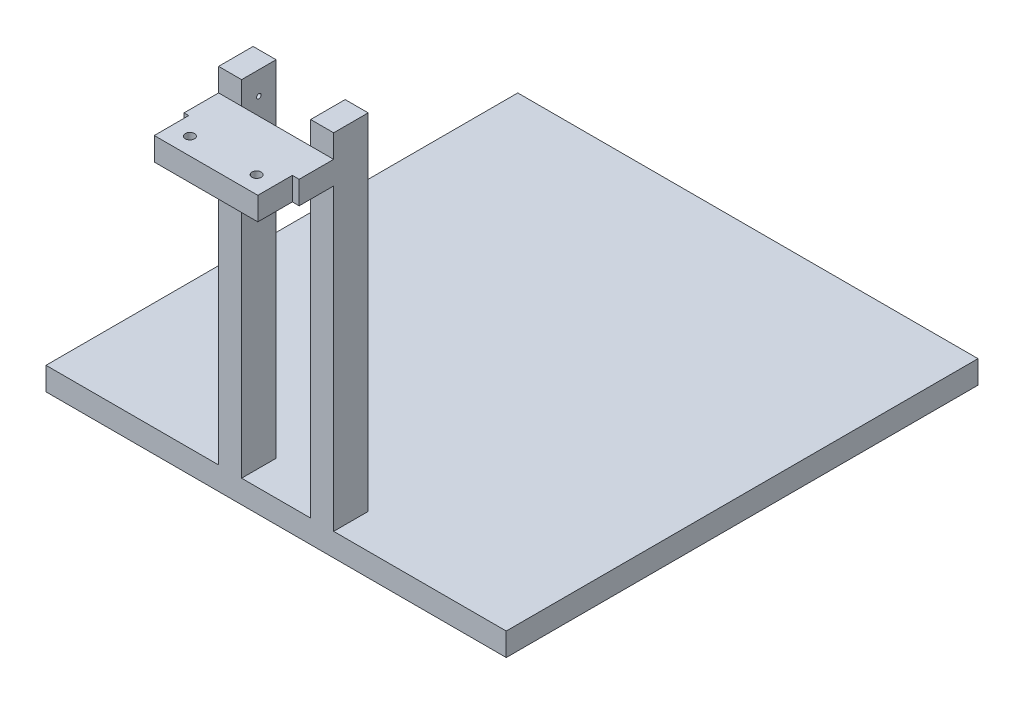
ISO-10303-21;
HEADER;
FILE_DESCRIPTION(('STEP AP214'),'2;1');
FILE_NAME('part.step','',(''),(''),'','','');
FILE_SCHEMA(('AUTOMOTIVE_DESIGN { 1 0 10303 214 1 1 1 1 }'));
ENDSEC;
DATA;
#1=APPLICATION_CONTEXT('core data for automotive mechanical design processes');
#2=APPLICATION_PROTOCOL_DEFINITION('international standard','automotive_design',2000,#1);
#3=PRODUCT_CONTEXT('',#1,'mechanical');
#4=PRODUCT('Part','Part','',(#3));
#5=PRODUCT_RELATED_PRODUCT_CATEGORY('part','',(#4));
#6=PRODUCT_DEFINITION_FORMATION('','',#4);
#7=PRODUCT_DEFINITION_CONTEXT('part definition',#1,'design');
#8=PRODUCT_DEFINITION('design','',#6,#7);
#9=PRODUCT_DEFINITION_SHAPE('','',#8);
#10=(LENGTH_UNIT() NAMED_UNIT(*) SI_UNIT(.MILLI.,.METRE.));
#11=(NAMED_UNIT(*) PLANE_ANGLE_UNIT() SI_UNIT($,.RADIAN.));
#12=(NAMED_UNIT(*) SI_UNIT($,.STERADIAN.) SOLID_ANGLE_UNIT());
#13=UNCERTAINTY_MEASURE_WITH_UNIT(LENGTH_MEASURE(1.E-05),#10,'distance_accuracy_value','');
#14=(GEOMETRIC_REPRESENTATION_CONTEXT(3) GLOBAL_UNCERTAINTY_ASSIGNED_CONTEXT((#13)) GLOBAL_UNIT_ASSIGNED_CONTEXT((#10,
#11,#12)) REPRESENTATION_CONTEXT('',''));
#15=CARTESIAN_POINT('',(0.,0.,0.));
#16=DIRECTION('',(0.,0.,1.));
#17=DIRECTION('',(1.,0.,0.));
#18=AXIS2_PLACEMENT_3D('',#15,#16,#17);
#19=CARTESIAN_POINT('',(0.,0.,117.5));
#20=DIRECTION('',(0.,0.,1.));
#21=DIRECTION('',(1.,0.,0.));
#22=AXIS2_PLACEMENT_3D('',#19,#20,#21);
#23=PLANE('',#22);
#24=DIRECTION('',(0.,1.,0.));
#25=VECTOR('',#24,1.);
#26=CARTESIAN_POINT('',(22.0474154078829,150.,117.5));
#27=LINE('',#26,#25);
#28=CARTESIAN_POINT('',(22.0474154078829,140.,117.5));
#29=VERTEX_POINT('',#28);
#30=CARTESIAN_POINT('',(22.0474154078829,150.,117.5));
#31=VERTEX_POINT('',#30);
#32=EDGE_CURVE('E218',#29,#31,#27,.T.);
#33=ORIENTED_EDGE('',*,*,#32,.F.);
#34=DIRECTION('',(1.,0.,0.));
#35=VECTOR('',#34,1.);
#36=CARTESIAN_POINT('',(0.,140.,117.5));
#37=LINE('',#36,#35);
#38=CARTESIAN_POINT('',(25.,140.,117.5));
#39=VERTEX_POINT('',#38);
#40=EDGE_CURVE('E232',#29,#39,#37,.T.);
#41=ORIENTED_EDGE('',*,*,#40,.T.);
#42=DIRECTION('',(0.,1.,0.));
#43=VECTOR('',#42,1.);
#44=CARTESIAN_POINT('',(25.0000000000001,0.,117.5));
#45=LINE('',#44,#43);
#46=CARTESIAN_POINT('',(25.,150.,117.5));
#47=VERTEX_POINT('',#46);
#48=EDGE_CURVE('E231',#39,#47,#45,.T.);
#49=ORIENTED_EDGE('',*,*,#48,.T.);
#50=DIRECTION('',(1.,0.,0.));
#51=VECTOR('',#50,1.);
#52=CARTESIAN_POINT('',(0.,150.,117.5));
#53=LINE('',#52,#51);
#54=EDGE_CURVE('E60',#31,#47,#53,.T.);
#55=ORIENTED_EDGE('',*,*,#54,.F.);
#56=EDGE_LOOP('',(#33,#41,#49,#55));
#57=FACE_BOUND('',#56,.T.);
#58=ADVANCED_FACE('F40',(#57),#23,.T.);
#59=CARTESIAN_POINT('',(-100.,10.,102.5));
#60=DIRECTION('',(0.,0.,-1.));
#61=DIRECTION('',(-1.,0.,0.));
#62=AXIS2_PLACEMENT_3D('',#59,#60,#61);
#63=PLANE('',#62);
#64=DIRECTION('',(1.,0.,0.));
#65=VECTOR('',#64,1.);
#66=CARTESIAN_POINT('',(0.,140.,102.5));
#67=LINE('',#66,#65);
#68=CARTESIAN_POINT('',(-25.,140.,102.5));
#69=VERTEX_POINT('',#68);
#70=CARTESIAN_POINT('',(-15.,140.,102.5));
#71=VERTEX_POINT('',#70);
#72=EDGE_CURVE('E52',#69,#71,#67,.T.);
#73=ORIENTED_EDGE('',*,*,#72,.F.);
#74=DIRECTION('',(0.,-1.,0.));
#75=VECTOR('',#74,1.);
#76=CARTESIAN_POINT('',(-25.,160.,102.5));
#77=LINE('',#76,#75);
#78=CARTESIAN_POINT('',(-25.,10.,102.5));
#79=VERTEX_POINT('',#78);
#80=EDGE_CURVE('E333',#69,#79,#77,.T.);
#81=ORIENTED_EDGE('',*,*,#80,.T.);
#82=DIRECTION('',(1.,0.,0.));
#83=VECTOR('',#82,1.);
#84=CARTESIAN_POINT('',(-100.,10.,102.5));
#85=LINE('',#84,#83);
#86=CARTESIAN_POINT('',(-100.,10.,102.5));
#87=VERTEX_POINT('',#86);
#88=EDGE_CURVE('E364',#87,#79,#85,.T.);
#89=ORIENTED_EDGE('',*,*,#88,.F.);
#90=DIRECTION('',(0.,-1.,0.));
#91=VECTOR('',#90,1.);
#92=CARTESIAN_POINT('',(-100.,10.,102.5));
#93=LINE('',#92,#91);
#94=CARTESIAN_POINT('',(-100.,0.,102.5));
#95=VERTEX_POINT('',#94);
#96=EDGE_CURVE('E384',#87,#95,#93,.T.);
#97=ORIENTED_EDGE('',*,*,#96,.T.);
#98=DIRECTION('',(1.,0.,0.));
#99=VECTOR('',#98,1.);
#100=CARTESIAN_POINT('',(-100.,0.,102.5));
#101=LINE('',#100,#99);
#102=CARTESIAN_POINT('',(100.,0.,102.5));
#103=VERTEX_POINT('',#102);
#104=EDGE_CURVE('E357',#95,#103,#101,.T.);
#105=ORIENTED_EDGE('',*,*,#104,.T.);
#106=DIRECTION('',(0.,-1.,0.));
#107=VECTOR('',#106,1.);
#108=CARTESIAN_POINT('',(100.,10.,102.5));
#109=LINE('',#108,#107);
#110=CARTESIAN_POINT('',(100.,10.,102.5));
#111=VERTEX_POINT('',#110);
#112=EDGE_CURVE('E368',#111,#103,#109,.T.);
#113=ORIENTED_EDGE('',*,*,#112,.F.);
#114=CARTESIAN_POINT('',(25.,10.,102.5));
#115=VERTEX_POINT('',#114);
#116=EDGE_CURVE('E363',#115,#111,#85,.T.);
#117=ORIENTED_EDGE('',*,*,#116,.F.);
#118=DIRECTION('',(0.,-1.,0.));
#119=VECTOR('',#118,1.);
#120=CARTESIAN_POINT('',(25.,160.,102.5));
#121=LINE('',#120,#119);
#122=CARTESIAN_POINT('',(25.,140.,102.5));
#123=VERTEX_POINT('',#122);
#124=EDGE_CURVE('E291',#123,#115,#121,.T.);
#125=ORIENTED_EDGE('',*,*,#124,.F.);
#126=CARTESIAN_POINT('',(15.,140.,102.5));
#127=VERTEX_POINT('',#126);
#128=EDGE_CURVE('E11',#127,#123,#67,.T.);
#129=ORIENTED_EDGE('',*,*,#128,.F.);
#130=DIRECTION('',(0.,-1.,0.));
#131=VECTOR('',#130,1.);
#132=CARTESIAN_POINT('',(15.,160.,102.5));
#133=LINE('',#132,#131);
#134=CARTESIAN_POINT('',(15.,10.,102.5));
#135=VERTEX_POINT('',#134);
#136=EDGE_CURVE('E277',#127,#135,#133,.T.);
#137=ORIENTED_EDGE('',*,*,#136,.T.);
#138=CARTESIAN_POINT('',(-15.,10.,102.5));
#139=VERTEX_POINT('',#138);
#140=EDGE_CURVE('E369',#139,#135,#85,.T.);
#141=ORIENTED_EDGE('',*,*,#140,.F.);
#142=DIRECTION('',(0.,-1.,0.));
#143=VECTOR('',#142,1.);
#144=CARTESIAN_POINT('',(-15.,160.,102.5));
#145=LINE('',#144,#143);
#146=EDGE_CURVE('E328',#71,#139,#145,.T.);
#147=ORIENTED_EDGE('',*,*,#146,.F.);
#148=EDGE_LOOP('',(#73,#81,#89,#97,#105,#113,#117,#125,#129,#137,#141,#147));
#149=FACE_BOUND('',#148,.T.);
#150=ADVANCED_FACE('F442',(#149),#63,.F.);
#151=CARTESIAN_POINT('',(-25.,160.,102.5));
#152=VERTEX_POINT('',#151);
#153=CARTESIAN_POINT('',(-25.,150.,102.5));
#154=VERTEX_POINT('',#153);
#155=EDGE_CURVE('E335',#152,#154,#77,.T.);
#156=ORIENTED_EDGE('',*,*,#155,.T.);
#157=DIRECTION('',(1.,0.,0.));
#158=VECTOR('',#157,1.);
#159=CARTESIAN_POINT('',(0.,150.,102.5));
#160=LINE('',#159,#158);
#161=CARTESIAN_POINT('',(-15.,150.,102.5));
#162=VERTEX_POINT('',#161);
#163=EDGE_CURVE('E245',#154,#162,#160,.T.);
#164=ORIENTED_EDGE('',*,*,#163,.T.);
#165=CARTESIAN_POINT('',(-15.,160.,102.5));
#166=VERTEX_POINT('',#165);
#167=EDGE_CURVE('E329',#166,#162,#145,.T.);
#168=ORIENTED_EDGE('',*,*,#167,.F.);
#169=DIRECTION('',(1.,0.,0.));
#170=VECTOR('',#169,1.);
#171=CARTESIAN_POINT('',(0.,160.,102.5));
#172=LINE('',#171,#170);
#173=EDGE_CURVE('E312',#152,#166,#172,.T.);
#174=ORIENTED_EDGE('',*,*,#173,.F.);
#175=EDGE_LOOP('',(#156,#164,#168,#174));
#176=FACE_BOUND('',#175,.T.);
#177=ADVANCED_FACE('F479',(#176),#63,.F.);
#178=CARTESIAN_POINT('',(0.,10.,0.));
#179=DIRECTION('',(0.,1.,0.));
#180=DIRECTION('',(0.,0.,1.));
#181=AXIS2_PLACEMENT_3D('',#178,#179,#180);
#182=PLANE('',#181);
#183=DIRECTION('',(0.,0.,-1.));
#184=VECTOR('',#183,1.);
#185=CARTESIAN_POINT('',(25.,10.,0.));
#186=LINE('',#185,#184);
#187=CARTESIAN_POINT('',(25.,10.,87.5));
#188=VERTEX_POINT('',#187);
#189=EDGE_CURVE('E304',#115,#188,#186,.T.);
#190=ORIENTED_EDGE('',*,*,#189,.F.);
#191=ORIENTED_EDGE('',*,*,#116,.T.);
#192=DIRECTION('',(0.,0.,-1.));
#193=VECTOR('',#192,1.);
#194=CARTESIAN_POINT('',(100.,10.,-102.5));
#195=LINE('',#194,#193);
#196=CARTESIAN_POINT('',(100.,10.,-102.5));
#197=VERTEX_POINT('',#196);
#198=EDGE_CURVE('E352',#111,#197,#195,.T.);
#199=ORIENTED_EDGE('',*,*,#198,.T.);
#200=DIRECTION('',(-1.,0.,0.));
#201=VECTOR('',#200,1.);
#202=CARTESIAN_POINT('',(-100.,10.,-102.5));
#203=LINE('',#202,#201);
#204=CARTESIAN_POINT('',(-100.,10.,-102.5));
#205=VERTEX_POINT('',#204);
#206=EDGE_CURVE('E356',#197,#205,#203,.T.);
#207=ORIENTED_EDGE('',*,*,#206,.T.);
#208=DIRECTION('',(0.,0.,1.));
#209=VECTOR('',#208,1.);
#210=CARTESIAN_POINT('',(-100.,10.,-102.5));
#211=LINE('',#210,#209);
#212=EDGE_CURVE('E360',#205,#87,#211,.T.);
#213=ORIENTED_EDGE('',*,*,#212,.T.);
#214=ORIENTED_EDGE('',*,*,#88,.T.);
#215=DIRECTION('',(0.,0.,-1.));
#216=VECTOR('',#215,1.);
#217=CARTESIAN_POINT('',(-25.,10.,0.));
#218=LINE('',#217,#216);
#219=CARTESIAN_POINT('',(-25.,10.,87.5));
#220=VERTEX_POINT('',#219);
#221=EDGE_CURVE('E347',#79,#220,#218,.T.);
#222=ORIENTED_EDGE('',*,*,#221,.T.);
#223=DIRECTION('',(1.,0.,0.));
#224=VECTOR('',#223,1.);
#225=CARTESIAN_POINT('',(0.,10.,87.5));
#226=LINE('',#225,#224);
#227=CARTESIAN_POINT('',(-15.,10.,87.5));
#228=VERTEX_POINT('',#227);
#229=EDGE_CURVE('E339',#220,#228,#226,.T.);
#230=ORIENTED_EDGE('',*,*,#229,.T.);
#231=DIRECTION('',(0.,0.,1.));
#232=VECTOR('',#231,1.);
#233=CARTESIAN_POINT('',(-15.,10.,0.));
#234=LINE('',#233,#232);
#235=EDGE_CURVE('E343',#228,#139,#234,.T.);
#236=ORIENTED_EDGE('',*,*,#235,.T.);
#237=ORIENTED_EDGE('',*,*,#140,.T.);
#238=DIRECTION('',(0.,0.,1.));
#239=VECTOR('',#238,1.);
#240=CARTESIAN_POINT('',(15.,10.,0.));
#241=LINE('',#240,#239);
#242=CARTESIAN_POINT('',(15.,10.,87.5));
#243=VERTEX_POINT('',#242);
#244=EDGE_CURVE('E296',#243,#135,#241,.T.);
#245=ORIENTED_EDGE('',*,*,#244,.F.);
#246=DIRECTION('',(-1.,0.,0.));
#247=VECTOR('',#246,1.);
#248=CARTESIAN_POINT('',(0.,10.,87.5));
#249=LINE('',#248,#247);
#250=EDGE_CURVE('E300',#188,#243,#249,.T.);
#251=ORIENTED_EDGE('',*,*,#250,.F.);
#252=EDGE_LOOP('',(#190,#191,#199,#207,#213,#214,#222,#230,#236,#237,#245,#251));
#253=FACE_BOUND('',#252,.T.);
#254=ADVANCED_FACE('F423',(#253),#182,.T.);
#255=CARTESIAN_POINT('',(100.,10.,-102.5));
#256=DIRECTION('',(-1.,0.,0.));
#257=DIRECTION('',(0.,0.,1.));
#258=AXIS2_PLACEMENT_3D('',#255,#256,#257);
#259=PLANE('',#258);
#260=DIRECTION('',(0.,0.,-1.));
#261=VECTOR('',#260,1.);
#262=CARTESIAN_POINT('',(100.,0.,-102.5));
#263=LINE('',#262,#261);
#264=CARTESIAN_POINT('',(100.,0.,-102.5));
#265=VERTEX_POINT('',#264);
#266=EDGE_CURVE('E351',#103,#265,#263,.T.);
#267=ORIENTED_EDGE('',*,*,#266,.T.);
#268=DIRECTION('',(0.,-1.,0.));
#269=VECTOR('',#268,1.);
#270=CARTESIAN_POINT('',(100.,10.,-102.5));
#271=LINE('',#270,#269);
#272=EDGE_CURVE('E44',#197,#265,#271,.T.);
#273=ORIENTED_EDGE('',*,*,#272,.F.);
#274=ORIENTED_EDGE('',*,*,#198,.F.);
#275=ORIENTED_EDGE('',*,*,#112,.T.);
#276=EDGE_LOOP('',(#267,#273,#274,#275));
#277=FACE_BOUND('',#276,.T.);
#278=ADVANCED_FACE('F42',(#277),#259,.F.);
#279=CARTESIAN_POINT('',(-100.,10.,-102.5));
#280=DIRECTION('',(0.,0.,1.));
#281=DIRECTION('',(1.,0.,0.));
#282=AXIS2_PLACEMENT_3D('',#279,#280,#281);
#283=PLANE('',#282);
#284=DIRECTION('',(-1.,0.,0.));
#285=VECTOR('',#284,1.);
#286=CARTESIAN_POINT('',(-100.,0.,-102.5));
#287=LINE('',#286,#285);
#288=CARTESIAN_POINT('',(-100.,0.,-102.5));
#289=VERTEX_POINT('',#288);
#290=EDGE_CURVE('E373',#265,#289,#287,.T.);
#291=ORIENTED_EDGE('',*,*,#290,.T.);
#292=DIRECTION('',(0.,-1.,0.));
#293=VECTOR('',#292,1.);
#294=CARTESIAN_POINT('',(-100.,10.,-102.5));
#295=LINE('',#294,#293);
#296=EDGE_CURVE('E387',#205,#289,#295,.T.);
#297=ORIENTED_EDGE('',*,*,#296,.F.);
#298=ORIENTED_EDGE('',*,*,#206,.F.);
#299=ORIENTED_EDGE('',*,*,#272,.T.);
#300=EDGE_LOOP('',(#291,#297,#298,#299));
#301=FACE_BOUND('',#300,.T.);
#302=ADVANCED_FACE('F455',(#301),#283,.F.);
#303=CARTESIAN_POINT('',(-100.,10.,-102.5));
#304=DIRECTION('',(1.,0.,0.));
#305=DIRECTION('',(0.,0.,-1.));
#306=AXIS2_PLACEMENT_3D('',#303,#304,#305);
#307=PLANE('',#306);
#308=DIRECTION('',(0.,0.,1.));
#309=VECTOR('',#308,1.);
#310=CARTESIAN_POINT('',(-100.,0.,-102.5));
#311=LINE('',#310,#309);
#312=EDGE_CURVE('E376',#289,#95,#311,.T.);
#313=ORIENTED_EDGE('',*,*,#312,.T.);
#314=ORIENTED_EDGE('',*,*,#96,.F.);
#315=ORIENTED_EDGE('',*,*,#212,.F.);
#316=ORIENTED_EDGE('',*,*,#296,.T.);
#317=EDGE_LOOP('',(#313,#314,#315,#316));
#318=FACE_BOUND('',#317,.T.);
#319=ADVANCED_FACE('F457',(#318),#307,.F.);
#320=CARTESIAN_POINT('',(15.,160.,102.5));
#321=VERTEX_POINT('',#320);
#322=CARTESIAN_POINT('',(15.,150.,102.5));
#323=VERTEX_POINT('',#322);
#324=EDGE_CURVE('E278',#321,#323,#133,.T.);
#325=ORIENTED_EDGE('',*,*,#324,.T.);
#326=CARTESIAN_POINT('',(25.,150.,102.5));
#327=VERTEX_POINT('',#326);
#328=EDGE_CURVE('E50',#323,#327,#160,.T.);
#329=ORIENTED_EDGE('',*,*,#328,.T.);
#330=CARTESIAN_POINT('',(25.,160.,102.5));
#331=VERTEX_POINT('',#330);
#332=EDGE_CURVE('E292',#331,#327,#121,.T.);
#333=ORIENTED_EDGE('',*,*,#332,.F.);
#334=DIRECTION('',(-1.,0.,0.));
#335=VECTOR('',#334,1.);
#336=CARTESIAN_POINT('',(0.,160.,102.5));
#337=LINE('',#336,#335);
#338=EDGE_CURVE('E261',#331,#321,#337,.T.);
#339=ORIENTED_EDGE('',*,*,#338,.T.);
#340=EDGE_LOOP('',(#325,#329,#333,#339));
#341=FACE_BOUND('',#340,.T.);
#342=ADVANCED_FACE('F412',(#341),#63,.F.);
#343=CARTESIAN_POINT('',(0.,0.,0.));
#344=DIRECTION('',(0.,1.,0.));
#345=DIRECTION('',(0.,0.,1.));
#346=AXIS2_PLACEMENT_3D('',#343,#344,#345);
#347=PLANE('',#346);
#348=ORIENTED_EDGE('',*,*,#266,.F.);
#349=ORIENTED_EDGE('',*,*,#104,.F.);
#350=ORIENTED_EDGE('',*,*,#312,.F.);
#351=ORIENTED_EDGE('',*,*,#290,.F.);
#352=EDGE_LOOP('',(#348,#349,#350,#351));
#353=FACE_BOUND('',#352,.T.);
#354=ADVANCED_FACE('F454',(#353),#347,.F.);
#355=CARTESIAN_POINT('',(-25.,160.,0.));
#356=DIRECTION('',(1.,0.,0.));
#357=DIRECTION('',(0.,0.,-1.));
#358=AXIS2_PLACEMENT_3D('',#355,#356,#357);
#359=PLANE('',#358);
#360=ORIENTED_EDGE('',*,*,#221,.F.);
#361=ORIENTED_EDGE('',*,*,#80,.F.);
#362=DIRECTION('',(0.,0.,-1.));
#363=VECTOR('',#362,1.);
#364=CARTESIAN_POINT('',(-25.,140.,117.5));
#365=LINE('',#364,#363);
#366=CARTESIAN_POINT('',(-25.,140.,117.5));
#367=VERTEX_POINT('',#366);
#368=EDGE_CURVE('E240',#367,#69,#365,.T.);
#369=ORIENTED_EDGE('',*,*,#368,.F.);
#370=DIRECTION('',(0.,-1.,0.));
#371=VECTOR('',#370,1.);
#372=CARTESIAN_POINT('',(-25.0000000000001,0.,117.5));
#373=LINE('',#372,#371);
#374=CARTESIAN_POINT('',(-25.,150.,117.5));
#375=VERTEX_POINT('',#374);
#376=EDGE_CURVE('E238',#375,#367,#373,.T.);
#377=ORIENTED_EDGE('',*,*,#376,.F.);
#378=DIRECTION('',(0.,0.,-1.));
#379=VECTOR('',#378,1.);
#380=CARTESIAN_POINT('',(-25.,150.,117.5));
#381=LINE('',#380,#379);
#382=EDGE_CURVE('E251',#375,#154,#381,.T.);
#383=ORIENTED_EDGE('',*,*,#382,.T.);
#384=ORIENTED_EDGE('',*,*,#155,.F.);
#385=DIRECTION('',(0.,0.,1.));
#386=VECTOR('',#385,1.);
#387=CARTESIAN_POINT('',(-25.,160.,0.));
#388=LINE('',#387,#386);
#389=CARTESIAN_POINT('',(-25.,160.,87.5));
#390=VERTEX_POINT('',#389);
#391=EDGE_CURVE('E308',#390,#152,#388,.T.);
#392=ORIENTED_EDGE('',*,*,#391,.F.);
#393=DIRECTION('',(0.,-1.,0.));
#394=VECTOR('',#393,1.);
#395=CARTESIAN_POINT('',(-25.,160.,87.5));
#396=LINE('',#395,#394);
#397=EDGE_CURVE('E321',#390,#220,#396,.T.);
#398=ORIENTED_EDGE('',*,*,#397,.T.);
#399=EDGE_LOOP('',(#360,#361,#369,#377,#383,#384,#392,#398));
#400=FACE_BOUND('',#399,.T.);
#401=ADVANCED_FACE('F464',(#400),#359,.F.);
#402=CARTESIAN_POINT('',(-15.,160.,0.));
#403=DIRECTION('',(-1.,0.,0.));
#404=DIRECTION('',(0.,0.,1.));
#405=AXIS2_PLACEMENT_3D('',#402,#403,#404);
#406=PLANE('',#405);
#407=CARTESIAN_POINT('',(-15.,150.,95.));
#408=DIRECTION('',(1.,0.,0.));
#409=DIRECTION('',(0.,0.,-1.));
#410=AXIS2_PLACEMENT_3D('',#407,#408,#409);
#411=CIRCLE('',#410,0.999999999999998);
#412=CARTESIAN_POINT('',(-15.,150.,94.));
#413=VERTEX_POINT('',#412);
#414=EDGE_CURVE('E682',#413,#413,#411,.T.);
#415=ORIENTED_EDGE('',*,*,#414,.F.);
#416=EDGE_LOOP('',(#415));
#417=FACE_BOUND('',#416,.T.);
#418=ORIENTED_EDGE('',*,*,#235,.F.);
#419=DIRECTION('',(0.,-1.,0.));
#420=VECTOR('',#419,1.);
#421=CARTESIAN_POINT('',(-15.,160.,87.5));
#422=LINE('',#421,#420);
#423=CARTESIAN_POINT('',(-15.,160.,87.5));
#424=VERTEX_POINT('',#423);
#425=EDGE_CURVE('E325',#424,#228,#422,.T.);
#426=ORIENTED_EDGE('',*,*,#425,.F.);
#427=DIRECTION('',(0.,0.,-1.));
#428=VECTOR('',#427,1.);
#429=CARTESIAN_POINT('',(-15.,160.,0.));
#430=LINE('',#429,#428);
#431=EDGE_CURVE('E315',#166,#424,#430,.T.);
#432=ORIENTED_EDGE('',*,*,#431,.F.);
#433=ORIENTED_EDGE('',*,*,#167,.T.);
#434=EDGE_CURVE('E334',#162,#71,#145,.T.);
#435=ORIENTED_EDGE('',*,*,#434,.T.);
#436=ORIENTED_EDGE('',*,*,#146,.T.);
#437=EDGE_LOOP('',(#418,#426,#432,#433,#435,#436));
#438=FACE_BOUND('',#437,.T.);
#439=ADVANCED_FACE('F474',(#417,#438),#406,.F.);
#440=CARTESIAN_POINT('',(0.,160.,87.5));
#441=DIRECTION('',(0.,0.,1.));
#442=DIRECTION('',(1.,0.,0.));
#443=AXIS2_PLACEMENT_3D('',#440,#441,#442);
#444=PLANE('',#443);
#445=ORIENTED_EDGE('',*,*,#229,.F.);
#446=ORIENTED_EDGE('',*,*,#397,.F.);
#447=DIRECTION('',(-1.,0.,0.));
#448=VECTOR('',#447,1.);
#449=CARTESIAN_POINT('',(0.,160.,87.5));
#450=LINE('',#449,#448);
#451=EDGE_CURVE('E318',#424,#390,#450,.T.);
#452=ORIENTED_EDGE('',*,*,#451,.F.);
#453=ORIENTED_EDGE('',*,*,#425,.T.);
#454=EDGE_LOOP('',(#445,#446,#452,#453));
#455=FACE_BOUND('',#454,.T.);
#456=ADVANCED_FACE('F470',(#455),#444,.F.);
#457=CARTESIAN_POINT('',(0.,160.,0.));
#458=DIRECTION('',(0.,1.,0.));
#459=DIRECTION('',(0.,0.,1.));
#460=AXIS2_PLACEMENT_3D('',#457,#458,#459);
#461=PLANE('',#460);
#462=ORIENTED_EDGE('',*,*,#391,.T.);
#463=ORIENTED_EDGE('',*,*,#173,.T.);
#464=ORIENTED_EDGE('',*,*,#431,.T.);
#465=ORIENTED_EDGE('',*,*,#451,.T.);
#466=EDGE_LOOP('',(#462,#463,#464,#465));
#467=FACE_BOUND('',#466,.T.);
#468=ADVANCED_FACE('F529',(#467),#461,.T.);
#469=CARTESIAN_POINT('',(25.,160.,0.));
#470=DIRECTION('',(1.,0.,0.));
#471=DIRECTION('',(0.,0.,-1.));
#472=AXIS2_PLACEMENT_3D('',#469,#470,#471);
#473=PLANE('',#472);
#474=ORIENTED_EDGE('',*,*,#332,.T.);
#475=DIRECTION('',(0.,0.,-1.));
#476=VECTOR('',#475,1.);
#477=CARTESIAN_POINT('',(25.,150.,117.5));
#478=LINE('',#477,#476);
#479=EDGE_CURVE('E254',#47,#327,#478,.T.);
#480=ORIENTED_EDGE('',*,*,#479,.F.);
#481=ORIENTED_EDGE('',*,*,#48,.F.);
#482=DIRECTION('',(0.,0.,-1.));
#483=VECTOR('',#482,1.);
#484=CARTESIAN_POINT('',(25.,140.,117.5));
#485=LINE('',#484,#483);
#486=EDGE_CURVE('E257',#39,#123,#485,.T.);
#487=ORIENTED_EDGE('',*,*,#486,.T.);
#488=ORIENTED_EDGE('',*,*,#124,.T.);
#489=ORIENTED_EDGE('',*,*,#189,.T.);
#490=DIRECTION('',(0.,-1.,0.));
#491=VECTOR('',#490,1.);
#492=CARTESIAN_POINT('',(25.,160.,87.5));
#493=LINE('',#492,#491);
#494=CARTESIAN_POINT('',(25.,160.,87.5));
#495=VERTEX_POINT('',#494);
#496=EDGE_CURVE('E287',#495,#188,#493,.T.);
#497=ORIENTED_EDGE('',*,*,#496,.F.);
#498=DIRECTION('',(0.,0.,1.));
#499=VECTOR('',#498,1.);
#500=CARTESIAN_POINT('',(25.,160.,0.));
#501=LINE('',#500,#499);
#502=EDGE_CURVE('E265',#495,#331,#501,.T.);
#503=ORIENTED_EDGE('',*,*,#502,.T.);
#504=EDGE_LOOP('',(#474,#480,#481,#487,#488,#489,#497,#503));
#505=FACE_BOUND('',#504,.T.);
#506=ADVANCED_FACE('F427',(#505),#473,.T.);
#507=CARTESIAN_POINT('',(0.,160.,87.5));
#508=DIRECTION('',(0.,0.,-1.));
#509=DIRECTION('',(-1.,0.,0.));
#510=AXIS2_PLACEMENT_3D('',#507,#508,#509);
#511=PLANE('',#510);
#512=ORIENTED_EDGE('',*,*,#496,.T.);
#513=ORIENTED_EDGE('',*,*,#250,.T.);
#514=DIRECTION('',(0.,-1.,0.));
#515=VECTOR('',#514,1.);
#516=CARTESIAN_POINT('',(15.,160.,87.5));
#517=LINE('',#516,#515);
#518=CARTESIAN_POINT('',(15.,160.,87.5));
#519=VERTEX_POINT('',#518);
#520=EDGE_CURVE('E282',#519,#243,#517,.T.);
#521=ORIENTED_EDGE('',*,*,#520,.F.);
#522=DIRECTION('',(1.,0.,0.));
#523=VECTOR('',#522,1.);
#524=CARTESIAN_POINT('',(0.,160.,87.5));
#525=LINE('',#524,#523);
#526=EDGE_CURVE('E269',#519,#495,#525,.T.);
#527=ORIENTED_EDGE('',*,*,#526,.T.);
#528=EDGE_LOOP('',(#512,#513,#521,#527));
#529=FACE_BOUND('',#528,.T.);
#530=ADVANCED_FACE('F420',(#529),#511,.T.);
#531=CARTESIAN_POINT('',(15.,160.,0.));
#532=DIRECTION('',(-1.,0.,0.));
#533=DIRECTION('',(0.,0.,1.));
#534=AXIS2_PLACEMENT_3D('',#531,#532,#533);
#535=PLANE('',#534);
#536=CARTESIAN_POINT('',(15.,150.,95.));
#537=DIRECTION('',(1.,0.,0.));
#538=DIRECTION('',(0.,0.,-1.));
#539=AXIS2_PLACEMENT_3D('',#536,#537,#538);
#540=CIRCLE('',#539,0.999999999999998);
#541=CARTESIAN_POINT('',(15.,150.,94.));
#542=VERTEX_POINT('',#541);
#543=EDGE_CURVE('E690',#542,#542,#540,.T.);
#544=ORIENTED_EDGE('',*,*,#543,.T.);
#545=EDGE_LOOP('',(#544));
#546=FACE_BOUND('',#545,.T.);
#547=ORIENTED_EDGE('',*,*,#520,.T.);
#548=ORIENTED_EDGE('',*,*,#244,.T.);
#549=ORIENTED_EDGE('',*,*,#136,.F.);
#550=EDGE_CURVE('E283',#323,#127,#133,.T.);
#551=ORIENTED_EDGE('',*,*,#550,.F.);
#552=ORIENTED_EDGE('',*,*,#324,.F.);
#553=DIRECTION('',(0.,0.,-1.));
#554=VECTOR('',#553,1.);
#555=CARTESIAN_POINT('',(15.,160.,0.));
#556=LINE('',#555,#554);
#557=EDGE_CURVE('E273',#321,#519,#556,.T.);
#558=ORIENTED_EDGE('',*,*,#557,.T.);
#559=EDGE_LOOP('',(#547,#548,#549,#551,#552,#558));
#560=FACE_BOUND('',#559,.T.);
#561=ADVANCED_FACE('F410',(#546,#560),#535,.T.);
#562=CARTESIAN_POINT('',(0.,160.,0.));
#563=DIRECTION('',(0.,1.,0.));
#564=DIRECTION('',(0.,0.,1.));
#565=AXIS2_PLACEMENT_3D('',#562,#563,#564);
#566=PLANE('',#565);
#567=ORIENTED_EDGE('',*,*,#338,.F.);
#568=ORIENTED_EDGE('',*,*,#502,.F.);
#569=ORIENTED_EDGE('',*,*,#526,.F.);
#570=ORIENTED_EDGE('',*,*,#557,.F.);
#571=EDGE_LOOP('',(#567,#568,#569,#570));
#572=FACE_BOUND('',#571,.T.);
#573=ADVANCED_FACE('F418',(#572),#566,.T.);
#574=CARTESIAN_POINT('',(0.,0.,102.5));
#575=DIRECTION('',(0.,0.,1.));
#576=DIRECTION('',(1.,0.,0.));
#577=AXIS2_PLACEMENT_3D('',#574,#575,#576);
#578=PLANE('',#577);
#579=EDGE_CURVE('E244',#162,#323,#160,.T.);
#580=ORIENTED_EDGE('',*,*,#579,.T.);
#581=ORIENTED_EDGE('',*,*,#550,.T.);
#582=EDGE_CURVE('E53',#71,#127,#67,.T.);
#583=ORIENTED_EDGE('',*,*,#582,.F.);
#584=ORIENTED_EDGE('',*,*,#434,.F.);
#585=EDGE_LOOP('',(#580,#581,#583,#584));
#586=FACE_BOUND('',#585,.T.);
#587=ADVANCED_FACE('F406',(#586),#578,.F.);
#588=CARTESIAN_POINT('',(0.,140.,117.5));
#589=DIRECTION('',(0.,1.,0.));
#590=DIRECTION('',(0.,0.,1.));
#591=AXIS2_PLACEMENT_3D('',#588,#589,#590);
#592=PLANE('',#591);
#593=CARTESIAN_POINT('',(-14.9525845921171,140.,125.));
#594=DIRECTION('',(0.,1.,0.));
#595=DIRECTION('',(0.,0.,1.));
#596=AXIS2_PLACEMENT_3D('',#593,#594,#595);
#597=CIRCLE('',#596,2.);
#598=CARTESIAN_POINT('',(-14.9525845921171,140.,127.));
#599=VERTEX_POINT('',#598);
#600=EDGE_CURVE('E661',#599,#599,#597,.T.);
#601=ORIENTED_EDGE('',*,*,#600,.T.);
#602=EDGE_LOOP('',(#601));
#603=FACE_BOUND('',#602,.T.);
#604=CARTESIAN_POINT('',(14.0474154078829,140.,125.));
#605=DIRECTION('',(0.,1.,0.));
#606=DIRECTION('',(0.,0.,1.));
#607=AXIS2_PLACEMENT_3D('',#604,#605,#606);
#608=CIRCLE('',#607,2.);
#609=CARTESIAN_POINT('',(14.0474154078829,140.,127.));
#610=VERTEX_POINT('',#609);
#611=EDGE_CURVE('E669',#610,#610,#608,.T.);
#612=ORIENTED_EDGE('',*,*,#611,.T.);
#613=EDGE_LOOP('',(#612));
#614=FACE_BOUND('',#613,.T.);
#615=ORIENTED_EDGE('',*,*,#72,.T.);
#616=ORIENTED_EDGE('',*,*,#582,.T.);
#617=ORIENTED_EDGE('',*,*,#128,.T.);
#618=ORIENTED_EDGE('',*,*,#486,.F.);
#619=ORIENTED_EDGE('',*,*,#40,.F.);
#620=DIRECTION('',(0.,0.,-1.));
#621=VECTOR('',#620,1.);
#622=CARTESIAN_POINT('',(22.0474154078829,140.,132.5));
#623=LINE('',#622,#621);
#624=CARTESIAN_POINT('',(22.0474154078829,140.,132.5));
#625=VERTEX_POINT('',#624);
#626=EDGE_CURVE('E655',#625,#29,#623,.T.);
#627=ORIENTED_EDGE('',*,*,#626,.F.);
#628=DIRECTION('',(1.,0.,0.));
#629=VECTOR('',#628,1.);
#630=CARTESIAN_POINT('',(22.0474154078829,140.,132.5));
#631=LINE('',#630,#629);
#632=CARTESIAN_POINT('',(-22.9525845921171,140.,132.5));
#633=VERTEX_POINT('',#632);
#634=EDGE_CURVE('E211',#633,#625,#631,.T.);
#635=ORIENTED_EDGE('',*,*,#634,.F.);
#636=DIRECTION('',(0.,0.,-1.));
#637=VECTOR('',#636,1.);
#638=CARTESIAN_POINT('',(-22.9525845921171,140.,132.5));
#639=LINE('',#638,#637);
#640=CARTESIAN_POINT('',(-22.9525845921171,140.,117.5));
#641=VERTEX_POINT('',#640);
#642=EDGE_CURVE('E224',#633,#641,#639,.T.);
#643=ORIENTED_EDGE('',*,*,#642,.T.);
#644=EDGE_CURVE('E228',#367,#641,#37,.T.);
#645=ORIENTED_EDGE('',*,*,#644,.F.);
#646=ORIENTED_EDGE('',*,*,#368,.T.);
#647=EDGE_LOOP('',(#615,#616,#617,#618,#619,#627,#635,#643,#645,#646));
#648=FACE_BOUND('',#647,.T.);
#649=ADVANCED_FACE('F440',(#603,#614,#648),#592,.F.);
#650=CARTESIAN_POINT('',(0.,150.,117.5));
#651=DIRECTION('',(0.,1.,0.));
#652=DIRECTION('',(0.,0.,1.));
#653=AXIS2_PLACEMENT_3D('',#650,#651,#652);
#654=PLANE('',#653);
#655=CARTESIAN_POINT('',(-14.9525845921171,150.,125.));
#656=DIRECTION('',(0.,1.,0.));
#657=DIRECTION('',(0.,0.,1.));
#658=AXIS2_PLACEMENT_3D('',#655,#656,#657);
#659=CIRCLE('',#658,2.);
#660=CARTESIAN_POINT('',(-14.9525845921171,150.,127.));
#661=VERTEX_POINT('',#660);
#662=EDGE_CURVE('E673',#661,#661,#659,.T.);
#663=ORIENTED_EDGE('',*,*,#662,.F.);
#664=EDGE_LOOP('',(#663));
#665=FACE_BOUND('',#664,.T.);
#666=CARTESIAN_POINT('',(14.0474154078829,150.,125.));
#667=DIRECTION('',(0.,1.,0.));
#668=DIRECTION('',(0.,0.,-1.));
#669=AXIS2_PLACEMENT_3D('',#666,#667,#668);
#670=CIRCLE('',#669,2.);
#671=CARTESIAN_POINT('',(14.0474154078829,150.,123.));
#672=VERTEX_POINT('',#671);
#673=EDGE_CURVE('E674',#672,#672,#670,.T.);
#674=ORIENTED_EDGE('',*,*,#673,.F.);
#675=EDGE_LOOP('',(#674));
#676=FACE_BOUND('',#675,.T.);
#677=ORIENTED_EDGE('',*,*,#163,.F.);
#678=ORIENTED_EDGE('',*,*,#382,.F.);
#679=CARTESIAN_POINT('',(-22.9525845921171,150.,117.5));
#680=VERTEX_POINT('',#679);
#681=EDGE_CURVE('E235',#375,#680,#53,.T.);
#682=ORIENTED_EDGE('',*,*,#681,.T.);
#683=DIRECTION('',(0.,0.,-1.));
#684=VECTOR('',#683,1.);
#685=CARTESIAN_POINT('',(-22.9525845921171,150.,132.5));
#686=LINE('',#685,#684);
#687=CARTESIAN_POINT('',(-22.9525845921171,150.,132.5));
#688=VERTEX_POINT('',#687);
#689=EDGE_CURVE('E201',#688,#680,#686,.T.);
#690=ORIENTED_EDGE('',*,*,#689,.F.);
#691=DIRECTION('',(-1.,0.,0.));
#692=VECTOR('',#691,1.);
#693=CARTESIAN_POINT('',(-22.9525845921171,150.,132.5));
#694=LINE('',#693,#692);
#695=CARTESIAN_POINT('',(22.0474154078829,150.,132.5));
#696=VERTEX_POINT('',#695);
#697=EDGE_CURVE('E193',#696,#688,#694,.T.);
#698=ORIENTED_EDGE('',*,*,#697,.F.);
#699=DIRECTION('',(0.,0.,-1.));
#700=VECTOR('',#699,1.);
#701=CARTESIAN_POINT('',(22.0474154078829,150.,132.5));
#702=LINE('',#701,#700);
#703=EDGE_CURVE('E198',#696,#31,#702,.T.);
#704=ORIENTED_EDGE('',*,*,#703,.T.);
#705=ORIENTED_EDGE('',*,*,#54,.T.);
#706=ORIENTED_EDGE('',*,*,#479,.T.);
#707=ORIENTED_EDGE('',*,*,#328,.F.);
#708=ORIENTED_EDGE('',*,*,#579,.F.);
#709=EDGE_LOOP('',(#677,#678,#682,#690,#698,#704,#705,#706,#707,#708));
#710=FACE_BOUND('',#709,.T.);
#711=ADVANCED_FACE('F196',(#665,#676,#710),#654,.T.);
#712=DIRECTION('',(0.,-1.,0.));
#713=VECTOR('',#712,1.);
#714=CARTESIAN_POINT('',(-22.9525845921171,140.,117.5));
#715=LINE('',#714,#713);
#716=EDGE_CURVE('E68',#680,#641,#715,.T.);
#717=ORIENTED_EDGE('',*,*,#716,.F.);
#718=ORIENTED_EDGE('',*,*,#681,.F.);
#719=ORIENTED_EDGE('',*,*,#376,.T.);
#720=ORIENTED_EDGE('',*,*,#644,.T.);
#721=EDGE_LOOP('',(#717,#718,#719,#720));
#722=FACE_BOUND('',#721,.T.);
#723=ADVANCED_FACE('F482',(#722),#23,.T.);
#724=CARTESIAN_POINT('',(22.0474154078829,150.,132.5));
#725=DIRECTION('',(-1.,0.,0.));
#726=DIRECTION('',(0.,0.,1.));
#727=AXIS2_PLACEMENT_3D('',#724,#725,#726);
#728=PLANE('',#727);
#729=ORIENTED_EDGE('',*,*,#32,.T.);
#730=ORIENTED_EDGE('',*,*,#703,.F.);
#731=DIRECTION('',(0.,1.,0.));
#732=VECTOR('',#731,1.);
#733=CARTESIAN_POINT('',(22.0474154078829,150.,132.5));
#734=LINE('',#733,#732);
#735=EDGE_CURVE('E206',#625,#696,#734,.T.);
#736=ORIENTED_EDGE('',*,*,#735,.F.);
#737=ORIENTED_EDGE('',*,*,#626,.T.);
#738=EDGE_LOOP('',(#729,#730,#736,#737));
#739=FACE_BOUND('',#738,.T.);
#740=ADVANCED_FACE('F217',(#739),#728,.F.);
#741=CARTESIAN_POINT('',(-22.9525845921171,140.,132.5));
#742=DIRECTION('',(1.,0.,0.));
#743=DIRECTION('',(0.,0.,-1.));
#744=AXIS2_PLACEMENT_3D('',#741,#742,#743);
#745=PLANE('',#744);
#746=ORIENTED_EDGE('',*,*,#716,.T.);
#747=ORIENTED_EDGE('',*,*,#642,.F.);
#748=DIRECTION('',(0.,-1.,0.));
#749=VECTOR('',#748,1.);
#750=CARTESIAN_POINT('',(-22.9525845921171,140.,132.5));
#751=LINE('',#750,#749);
#752=EDGE_CURVE('E205',#688,#633,#751,.T.);
#753=ORIENTED_EDGE('',*,*,#752,.F.);
#754=ORIENTED_EDGE('',*,*,#689,.T.);
#755=EDGE_LOOP('',(#746,#747,#753,#754));
#756=FACE_BOUND('',#755,.T.);
#757=ADVANCED_FACE('F489',(#756),#745,.F.);
#758=CARTESIAN_POINT('',(0.,0.,132.5));
#759=DIRECTION('',(0.,0.,-1.));
#760=DIRECTION('',(-1.,0.,0.));
#761=AXIS2_PLACEMENT_3D('',#758,#759,#760);
#762=PLANE('',#761);
#763=ORIENTED_EDGE('',*,*,#735,.T.);
#764=ORIENTED_EDGE('',*,*,#697,.T.);
#765=ORIENTED_EDGE('',*,*,#752,.T.);
#766=ORIENTED_EDGE('',*,*,#634,.T.);
#767=EDGE_LOOP('',(#763,#764,#765,#766));
#768=FACE_BOUND('',#767,.T.);
#769=ADVANCED_FACE('F209',(#768),#762,.F.);
#770=CARTESIAN_POINT('',(14.0474154078829,135.,125.));
#771=DIRECTION('',(0.,1.,0.));
#772=DIRECTION('',(0.,0.,1.));
#773=AXIS2_PLACEMENT_3D('',#770,#771,#772);
#774=CYLINDRICAL_SURFACE('',#773,2.);
#775=ORIENTED_EDGE('',*,*,#673,.T.);
#776=EDGE_LOOP('',(#775));
#777=FACE_BOUND('',#776,.T.);
#778=ORIENTED_EDGE('',*,*,#611,.F.);
#779=EDGE_LOOP('',(#778));
#780=FACE_BOUND('',#779,.T.);
#781=ADVANCED_FACE('F566',(#777,#780),#774,.F.);
#782=CARTESIAN_POINT('',(-14.9525845921171,135.,125.));
#783=DIRECTION('',(0.,1.,0.));
#784=DIRECTION('',(0.,0.,1.));
#785=AXIS2_PLACEMENT_3D('',#782,#783,#784);
#786=CYLINDRICAL_SURFACE('',#785,2.);
#787=ORIENTED_EDGE('',*,*,#662,.T.);
#788=EDGE_LOOP('',(#787));
#789=FACE_BOUND('',#788,.T.);
#790=ORIENTED_EDGE('',*,*,#600,.F.);
#791=EDGE_LOOP('',(#790));
#792=FACE_BOUND('',#791,.T.);
#793=ADVANCED_FACE('F571',(#789,#792),#786,.F.);
#794=CARTESIAN_POINT('',(-20.,150.,95.));
#795=DIRECTION('',(1.,0.,0.));
#796=DIRECTION('',(0.,0.,-1.));
#797=AXIS2_PLACEMENT_3D('',#794,#795,#796);
#798=CYLINDRICAL_SURFACE('',#797,0.999999999999998);
#799=CARTESIAN_POINT('',(-20.,150.,95.));
#800=DIRECTION('',(1.,0.,0.));
#801=DIRECTION('',(0.,0.,-1.));
#802=AXIS2_PLACEMENT_3D('',#799,#800,#801);
#803=CIRCLE('',#802,0.999999999999998);
#804=CARTESIAN_POINT('',(-20.,150.,94.));
#805=VERTEX_POINT('',#804);
#806=EDGE_CURVE('E678',#805,#805,#803,.T.);
#807=ORIENTED_EDGE('',*,*,#806,.F.);
#808=EDGE_LOOP('',(#807));
#809=FACE_BOUND('',#808,.T.);
#810=ORIENTED_EDGE('',*,*,#414,.T.);
#811=EDGE_LOOP('',(#810));
#812=FACE_BOUND('',#811,.T.);
#813=ADVANCED_FACE('F583',(#809,#812),#798,.F.);
#814=CARTESIAN_POINT('',(-20.,0.,0.));
#815=DIRECTION('',(1.,0.,0.));
#816=DIRECTION('',(0.,0.,-1.));
#817=AXIS2_PLACEMENT_3D('',#814,#815,#816);
#818=PLANE('',#817);
#819=ORIENTED_EDGE('',*,*,#806,.T.);
#820=EDGE_LOOP('',(#819));
#821=FACE_BOUND('',#820,.T.);
#822=ADVANCED_FACE('F601',(#821),#818,.T.);
#823=CARTESIAN_POINT('',(20.,150.,95.));
#824=DIRECTION('',(-1.,0.,0.));
#825=DIRECTION('',(0.,0.,1.));
#826=AXIS2_PLACEMENT_3D('',#823,#824,#825);
#827=CYLINDRICAL_SURFACE('',#826,0.999999999999998);
#828=CARTESIAN_POINT('',(20.,150.,95.));
#829=DIRECTION('',(1.,0.,0.));
#830=DIRECTION('',(0.,0.,-1.));
#831=AXIS2_PLACEMENT_3D('',#828,#829,#830);
#832=CIRCLE('',#831,0.999999999999998);
#833=CARTESIAN_POINT('',(20.,150.,94.));
#834=VERTEX_POINT('',#833);
#835=EDGE_CURVE('E686',#834,#834,#832,.T.);
#836=ORIENTED_EDGE('',*,*,#835,.T.);
#837=EDGE_LOOP('',(#836));
#838=FACE_BOUND('',#837,.T.);
#839=ORIENTED_EDGE('',*,*,#543,.F.);
#840=EDGE_LOOP('',(#839));
#841=FACE_BOUND('',#840,.T.);
#842=ADVANCED_FACE('F611',(#838,#841),#827,.F.);
#843=CARTESIAN_POINT('',(20.,0.,0.));
#844=DIRECTION('',(1.,0.,0.));
#845=DIRECTION('',(0.,0.,-1.));
#846=AXIS2_PLACEMENT_3D('',#843,#844,#845);
#847=PLANE('',#846);
#848=ORIENTED_EDGE('',*,*,#835,.F.);
#849=EDGE_LOOP('',(#848));
#850=FACE_BOUND('',#849,.T.);
#851=ADVANCED_FACE('F629',(#850),#847,.F.);
#852=CLOSED_SHELL('',(#58,#150,#177,#254,#278,#302,#319,#342,#354,#401,#439,#456,#468,#506,#530,
#561,#573,#587,#649,#711,#723,#740,#757,#769,#781,#793,#813,#822,#842,#851));
#853=MANIFOLD_SOLID_BREP('B2',#852);
#854=ADVANCED_BREP_SHAPE_REPRESENTATION('',(#18,#853),#14);
#855=SHAPE_DEFINITION_REPRESENTATION(#9,#854);
ENDSEC;
END-ISO-10303-21;
